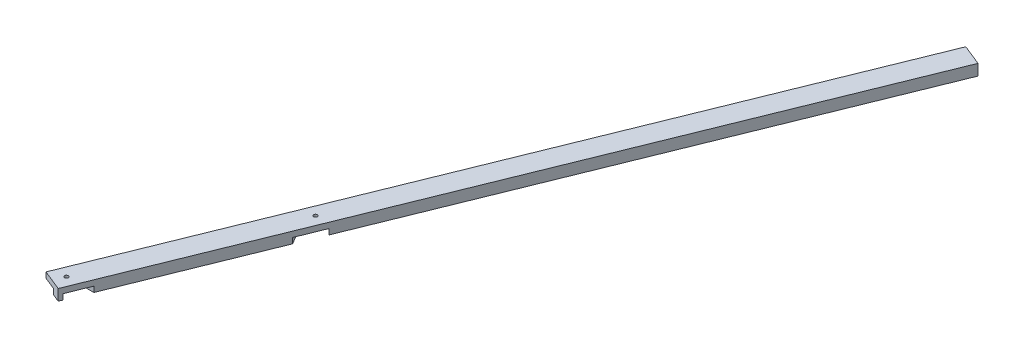
ISO-10303-21;
HEADER;
FILE_DESCRIPTION(('STEP AP214'),'2;1');
FILE_NAME('part.step','',(''),(''),'','','');
FILE_SCHEMA(('AUTOMOTIVE_DESIGN { 1 0 10303 214 1 1 1 1 }'));
ENDSEC;
DATA;
#1=APPLICATION_CONTEXT('core data for automotive mechanical design processes');
#2=APPLICATION_PROTOCOL_DEFINITION('international standard','automotive_design',2000,#1);
#3=PRODUCT_CONTEXT('',#1,'mechanical');
#4=PRODUCT('Part','Part','',(#3));
#5=PRODUCT_RELATED_PRODUCT_CATEGORY('part','',(#4));
#6=PRODUCT_DEFINITION_FORMATION('','',#4);
#7=PRODUCT_DEFINITION_CONTEXT('part definition',#1,'design');
#8=PRODUCT_DEFINITION('design','',#6,#7);
#9=PRODUCT_DEFINITION_SHAPE('','',#8);
#10=(LENGTH_UNIT() NAMED_UNIT(*) SI_UNIT(.MILLI.,.METRE.));
#11=(NAMED_UNIT(*) PLANE_ANGLE_UNIT() SI_UNIT($,.RADIAN.));
#12=(NAMED_UNIT(*) SI_UNIT($,.STERADIAN.) SOLID_ANGLE_UNIT());
#13=UNCERTAINTY_MEASURE_WITH_UNIT(LENGTH_MEASURE(1.E-05),#10,'distance_accuracy_value','');
#14=(GEOMETRIC_REPRESENTATION_CONTEXT(3) GLOBAL_UNCERTAINTY_ASSIGNED_CONTEXT((#13)) GLOBAL_UNIT_ASSIGNED_CONTEXT((#10,
#11,#12)) REPRESENTATION_CONTEXT('',''));
#15=CARTESIAN_POINT('',(0.,0.,0.));
#16=DIRECTION('',(0.,0.,1.));
#17=DIRECTION('',(1.,0.,0.));
#18=AXIS2_PLACEMENT_3D('',#15,#16,#17);
#19=CARTESIAN_POINT('',(0.,0.,0.));
#20=DIRECTION('',(0.,1.,0.));
#21=DIRECTION('',(0.,0.,1.));
#22=AXIS2_PLACEMENT_3D('',#19,#20,#21);
#23=PLANE('',#22);
#24=DIRECTION('',(-0.375,0.,0.927024810886958));
#25=VECTOR('',#24,1.);
#26=CARTESIAN_POINT('',(-254.02633760983,0.,-102.758713127153));
#27=LINE('',#26,#25);
#28=CARTESIAN_POINT('',(143.866072647397,0.,-1086.37507678598));
#29=VERTEX_POINT('',#28);
#30=CARTESIAN_POINT('',(-178.833212823124,0.,-288.641092554873));
#31=VERTEX_POINT('',#30);
#32=EDGE_CURVE('E210',#29,#31,#27,.T.);
#33=ORIENTED_EDGE('',*,*,#32,.T.);
#34=DIRECTION('',(0.508928571428567,0.,0.860808752966464));
#35=VECTOR('',#34,1.);
#36=CARTESIAN_POINT('',(-193.321682541703,0.,-313.147088584599));
#37=LINE('',#36,#35);
#38=CARTESIAN_POINT('',(-193.321682541703,0.,-313.147088584599));
#39=VERTEX_POINT('',#38);
#40=EDGE_CURVE('E145',#39,#31,#37,.T.);
#41=ORIENTED_EDGE('',*,*,#40,.F.);
#42=DIRECTION('',(0.860808752966462,0.,-0.508928571428569));
#43=VECTOR('',#42,1.);
#44=CARTESIAN_POINT('',(-215.267964048959,0.,-300.171976915291));
#45=LINE('',#44,#43);
#46=CARTESIAN_POINT('',(-215.267964048959,0.,-300.171976915291));
#47=VERTEX_POINT('',#46);
#48=EDGE_CURVE('E236',#47,#39,#45,.T.);
#49=ORIENTED_EDGE('',*,*,#48,.F.);
#50=DIRECTION('',(0.375,0.,-0.927024810886958));
#51=VECTOR('',#50,1.);
#52=CARTESIAN_POINT('',(-289.345982904623,0.,-117.046213127153));
#53=LINE('',#52,#51);
#54=CARTESIAN_POINT('',(108.546427352604,0.,-1100.66257678598));
#55=VERTEX_POINT('',#54);
#56=EDGE_CURVE('E216',#47,#55,#53,.T.);
#57=ORIENTED_EDGE('',*,*,#56,.T.);
#58=DIRECTION('',(0.927024810886958,0.,0.374999999999999));
#59=VECTOR('',#58,1.);
#60=CARTESIAN_POINT('',(397.892410257226,0.,-983.61636365883));
#61=LINE('',#60,#59);
#62=EDGE_CURVE('E213',#55,#29,#61,.T.);
#63=ORIENTED_EDGE('',*,*,#62,.T.);
#64=EDGE_LOOP('',(#33,#41,#49,#57,#63));
#65=FACE_BOUND('',#64,.T.);
#66=ADVANCED_FACE('F32',(#65),#23,.F.);
#67=CARTESIAN_POINT('',(-200.025,19.05,-287.053592554873));
#68=DIRECTION('',(0.,-1.,0.));
#69=DIRECTION('',(0.,0.,-1.));
#70=AXIS2_PLACEMENT_3D('',#67,#68,#69);
#71=CYLINDRICAL_SURFACE('',#70,3.175);
#72=CARTESIAN_POINT('',(-200.025,19.05,-287.053592554873));
#73=DIRECTION('',(0.,1.,0.));
#74=DIRECTION('',(0.,0.,1.));
#75=AXIS2_PLACEMENT_3D('',#72,#73,#74);
#76=CIRCLE('',#75,3.175);
#77=CARTESIAN_POINT('',(-200.025,19.05,-290.228592554873));
#78=VERTEX_POINT('',#77);
#79=EDGE_CURVE('E203',#78,#78,#76,.T.);
#80=CARTESIAN_POINT('',(-200.025,9.525,-287.053592554873));
#81=DIRECTION('',(0.,-1.,0.));
#82=DIRECTION('',(0.,0.,-1.));
#83=AXIS2_PLACEMENT_3D('',#80,#81,#82);
#84=CIRCLE('',#83,3.175);
#85=CARTESIAN_POINT('',(-200.025,9.525,-290.228592554873));
#86=VERTEX_POINT('',#85);
#87=EDGE_CURVE('E36',#86,#86,#84,.T.);
#88=CARTESIAN_POINT('',(-200.025,19.05,-290.228592554873));
#89=CARTESIAN_POINT('',(-200.025,18.95078125,-290.228592554873));
#90=CARTESIAN_POINT('',(-200.025,18.8515625,-290.228592554873));
#91=CARTESIAN_POINT('',(-200.025,18.653125,-290.228592554873));
#92=CARTESIAN_POINT('',(-200.025,18.55390625,-290.228592554873));
#93=CARTESIAN_POINT('',(-200.025,18.35546875,-290.228592554873));
#94=CARTESIAN_POINT('',(-200.025,18.25625,-290.228592554873));
#95=CARTESIAN_POINT('',(-200.025,18.0578125,-290.228592554873));
#96=CARTESIAN_POINT('',(-200.025,17.95859375,-290.228592554873));
#97=CARTESIAN_POINT('',(-200.025,17.76015625,-290.228592554873));
#98=CARTESIAN_POINT('',(-200.025,17.6609375,-290.228592554873));
#99=CARTESIAN_POINT('',(-200.025,17.4625,-290.228592554873));
#100=CARTESIAN_POINT('',(-200.025,17.36328125,-290.228592554873));
#101=CARTESIAN_POINT('',(-200.025,17.16484375,-290.228592554873));
#102=CARTESIAN_POINT('',(-200.025,17.065625,-290.228592554873));
#103=CARTESIAN_POINT('',(-200.025,16.8671875,-290.228592554873));
#104=CARTESIAN_POINT('',(-200.025,16.76796875,-290.228592554873));
#105=CARTESIAN_POINT('',(-200.025,16.56953125,-290.228592554873));
#106=CARTESIAN_POINT('',(-200.025,16.4703125,-290.228592554873));
#107=CARTESIAN_POINT('',(-200.025,16.271875,-290.228592554873));
#108=CARTESIAN_POINT('',(-200.025,16.17265625,-290.228592554873));
#109=CARTESIAN_POINT('',(-200.025,15.97421875,-290.228592554873));
#110=CARTESIAN_POINT('',(-200.025,15.875,-290.228592554873));
#111=CARTESIAN_POINT('',(-200.025,15.6765625,-290.228592554873));
#112=CARTESIAN_POINT('',(-200.025,15.57734375,-290.228592554873));
#113=CARTESIAN_POINT('',(-200.025,15.37890625,-290.228592554873));
#114=CARTESIAN_POINT('',(-200.025,15.2796875,-290.228592554873));
#115=CARTESIAN_POINT('',(-200.025,15.08125,-290.228592554873));
#116=CARTESIAN_POINT('',(-200.025,14.98203125,-290.228592554873));
#117=CARTESIAN_POINT('',(-200.025,14.78359375,-290.228592554873));
#118=CARTESIAN_POINT('',(-200.025,14.684375,-290.228592554873));
#119=CARTESIAN_POINT('',(-200.025,14.4859375,-290.228592554873));
#120=CARTESIAN_POINT('',(-200.025,14.38671875,-290.228592554873));
#121=CARTESIAN_POINT('',(-200.025,14.18828125,-290.228592554873));
#122=CARTESIAN_POINT('',(-200.025,14.0890625,-290.228592554873));
#123=CARTESIAN_POINT('',(-200.025,13.890625,-290.228592554873));
#124=CARTESIAN_POINT('',(-200.025,13.79140625,-290.228592554873));
#125=CARTESIAN_POINT('',(-200.025,13.59296875,-290.228592554873));
#126=CARTESIAN_POINT('',(-200.025,13.49375,-290.228592554873));
#127=CARTESIAN_POINT('',(-200.025,13.2953125,-290.228592554873));
#128=CARTESIAN_POINT('',(-200.025,13.19609375,-290.228592554873));
#129=CARTESIAN_POINT('',(-200.025,12.99765625,-290.228592554873));
#130=CARTESIAN_POINT('',(-200.025,12.8984375,-290.228592554873));
#131=CARTESIAN_POINT('',(-200.025,12.7,-290.228592554873));
#132=CARTESIAN_POINT('',(-200.025,12.60078125,-290.228592554873));
#133=CARTESIAN_POINT('',(-200.025,12.40234375,-290.228592554873));
#134=CARTESIAN_POINT('',(-200.025,12.303125,-290.228592554873));
#135=CARTESIAN_POINT('',(-200.025,12.1046875,-290.228592554873));
#136=CARTESIAN_POINT('',(-200.025,12.00546875,-290.228592554873));
#137=CARTESIAN_POINT('',(-200.025,11.80703125,-290.228592554873));
#138=CARTESIAN_POINT('',(-200.025,11.7078125,-290.228592554873));
#139=CARTESIAN_POINT('',(-200.025,11.509375,-290.228592554873));
#140=CARTESIAN_POINT('',(-200.025,11.41015625,-290.228592554873));
#141=CARTESIAN_POINT('',(-200.025,11.21171875,-290.228592554873));
#142=CARTESIAN_POINT('',(-200.025,11.1125,-290.228592554873));
#143=CARTESIAN_POINT('',(-200.025,10.9140625,-290.228592554873));
#144=CARTESIAN_POINT('',(-200.025,10.81484375,-290.228592554873));
#145=CARTESIAN_POINT('',(-200.025,10.61640625,-290.228592554873));
#146=CARTESIAN_POINT('',(-200.025,10.5171875,-290.228592554873));
#147=CARTESIAN_POINT('',(-200.025,10.31875,-290.228592554873));
#148=CARTESIAN_POINT('',(-200.025,10.21953125,-290.228592554873));
#149=CARTESIAN_POINT('',(-200.025,10.02109375,-290.228592554873));
#150=CARTESIAN_POINT('',(-200.025,9.921875,-290.228592554873));
#151=CARTESIAN_POINT('',(-200.025,9.7234375,-290.228592554873));
#152=CARTESIAN_POINT('',(-200.025,9.62421875,-290.228592554873));
#153=CARTESIAN_POINT('',(-200.025,9.525,-290.228592554873));
#154=B_SPLINE_CURVE_WITH_KNOTS('',3,(#88,#89,#90,#91,#92,#93,#94,#95,#96,#97,#98,#99,#100,#101,
#102,#103,#104,#105,#106,#107,#108,#109,#110,#111,#112,#113,#114,#115,#116,#117,#118,#119,#120,
#121,#122,#123,#124,#125,#126,#127,#128,#129,#130,#131,#132,#133,#134,#135,#136,#137,#138,#139,
#140,#141,#142,#143,#144,#145,#146,#147,#148,#149,#150,#151,#152,#153),.UNSPECIFIED.,.F.,.F.,(4,
2,2,2,2,2,2,2,2,2,2,2,2,2,2,2,2,2,2,2,2,2,2,2,2,2,2,2,2,2,2,2,4),(0.,0.29765625,0.5953125,
0.892968750000001,1.190625,1.48828125,1.7859375,2.08359375,2.38125,2.67890625,2.9765625,
3.27421875,3.571875,3.86953125,4.1671875,4.46484375,4.7625,5.06015625,5.3578125,5.65546875,
5.953125,6.25078125,6.5484375,6.84609375,7.14375,7.44140625,7.7390625,8.03671875,8.334375,
8.63203125,8.9296875,9.22734375,9.525),.UNSPECIFIED.);
#155=EDGE_CURVE('BSEAM289',#78,#86,#154,.T.);
#156=ORIENTED_EDGE('',*,*,#79,.T.);
#157=ORIENTED_EDGE('',*,*,#87,.T.);
#158=ORIENTED_EDGE('',*,*,#155,.T.);
#159=ORIENTED_EDGE('',*,*,#155,.F.);
#160=EDGE_LOOP('',(#156,#158,#157,#159));
#161=FACE_BOUND('',#160,.T.);
#162=ADVANCED_FACE('F289',(#161),#71,.F.);
#163=CARTESIAN_POINT('',(-254.02633760983,19.05,-102.758713127153));
#164=DIRECTION('',(0.927024810886958,0.,0.375));
#165=DIRECTION('',(0.375,0.,-0.927024810886958));
#166=AXIS2_PLACEMENT_3D('',#163,#164,#165);
#167=PLANE('',#166);
#168=DIRECTION('',(0.,-1.,0.));
#169=VECTOR('',#168,1.);
#170=CARTESIAN_POINT('',(-178.833212823124,9.525,-288.641092554873));
#171=LINE('',#170,#169);
#172=CARTESIAN_POINT('',(-178.833212823124,9.525,-288.641092554873));
#173=VERTEX_POINT('',#172);
#174=EDGE_CURVE('E230',#173,#31,#171,.T.);
#175=ORIENTED_EDGE('',*,*,#174,.T.);
#176=ORIENTED_EDGE('',*,*,#32,.F.);
#177=DIRECTION('',(0.,-1.,0.));
#178=VECTOR('',#177,1.);
#179=CARTESIAN_POINT('',(143.866072647397,19.05,-1086.37507678598));
#180=LINE('',#179,#178);
#181=CARTESIAN_POINT('',(143.866072647397,19.05,-1086.37507678598));
#182=VERTEX_POINT('',#181);
#183=EDGE_CURVE('E41',#182,#29,#180,.T.);
#184=ORIENTED_EDGE('',*,*,#183,.F.);
#185=DIRECTION('',(-0.375,0.,0.927024810886958));
#186=VECTOR('',#185,1.);
#187=CARTESIAN_POINT('',(-254.02633760983,19.05,-102.758713127153));
#188=LINE('',#187,#186);
#189=CARTESIAN_POINT('',(-313.333927352603,19.05,43.8535726473965));
#190=VERTEX_POINT('',#189);
#191=EDGE_CURVE('E190',#182,#190,#188,.T.);
#192=ORIENTED_EDGE('',*,*,#191,.T.);
#193=DIRECTION('',(0.,-1.,0.));
#194=VECTOR('',#193,1.);
#195=CARTESIAN_POINT('',(-313.333927352603,19.05,43.8535726473965));
#196=LINE('',#195,#194);
#197=CARTESIAN_POINT('',(-313.333927352603,0.,43.8535726473965));
#198=VERTEX_POINT('',#197);
#199=EDGE_CURVE('E11',#190,#198,#196,.T.);
#200=ORIENTED_EDGE('',*,*,#199,.T.);
#201=CARTESIAN_POINT('',(-311.006492620075,0.,38.1000000000001));
#202=VERTEX_POINT('',#201);
#203=EDGE_CURVE('E209',#202,#198,#27,.T.);
#204=ORIENTED_EDGE('',*,*,#203,.F.);
#205=DIRECTION('',(0.,-1.,0.));
#206=VECTOR('',#205,1.);
#207=CARTESIAN_POINT('',(-311.006492620075,9.525,38.1000000000001));
#208=LINE('',#207,#206);
#209=CARTESIAN_POINT('',(-311.006492620075,9.525,38.1000000000001));
#210=VERTEX_POINT('',#209);
#211=EDGE_CURVE('E56',#210,#202,#208,.T.);
#212=ORIENTED_EDGE('',*,*,#211,.F.);
#213=DIRECTION('',(-0.375,0.,0.927024810886958));
#214=VECTOR('',#213,1.);
#215=CARTESIAN_POINT('',(-254.02633760983,9.525,-102.758713127153));
#216=LINE('',#215,#214);
#217=CARTESIAN_POINT('',(-295.594283764166,9.525,1.80411241501588E-13));
#218=VERTEX_POINT('',#217);
#219=EDGE_CURVE('E160',#218,#210,#216,.T.);
#220=ORIENTED_EDGE('',*,*,#219,.F.);
#221=DIRECTION('',(0.,-1.,0.));
#222=VECTOR('',#221,1.);
#223=CARTESIAN_POINT('',(-295.594283764166,9.525,1.80411241501588E-13));
#224=LINE('',#223,#222);
#225=CARTESIAN_POINT('',(-295.594283764166,0.,1.80411241501588E-13));
#226=VERTEX_POINT('',#225);
#227=EDGE_CURVE('E175',#218,#226,#224,.T.);
#228=ORIENTED_EDGE('',*,*,#227,.T.);
#229=CARTESIAN_POINT('',(-196.814123155019,0.,-244.191092554874));
#230=VERTEX_POINT('',#229);
#231=EDGE_CURVE('E150',#230,#226,#27,.T.);
#232=ORIENTED_EDGE('',*,*,#231,.F.);
#233=DIRECTION('',(0.,-1.,0.));
#234=VECTOR('',#233,1.);
#235=CARTESIAN_POINT('',(-196.814123155019,9.525,-244.191092554873));
#236=LINE('',#235,#234);
#237=CARTESIAN_POINT('',(-196.814123155019,9.525,-244.191092554873));
#238=VERTEX_POINT('',#237);
#239=EDGE_CURVE('E48',#238,#230,#236,.T.);
#240=ORIENTED_EDGE('',*,*,#239,.F.);
#241=DIRECTION('',(-0.375000000000001,0.,0.927024810886958));
#242=VECTOR('',#241,1.);
#243=CARTESIAN_POINT('',(-178.833212823124,9.525,-288.641092554873));
#244=LINE('',#243,#242);
#245=EDGE_CURVE('E135',#173,#238,#244,.T.);
#246=ORIENTED_EDGE('',*,*,#245,.F.);
#247=EDGE_LOOP('',(#175,#176,#184,#192,#200,#204,#212,#220,#228,#232,#240,#246));
#248=FACE_BOUND('',#247,.T.);
#249=ADVANCED_FACE('F148',(#248),#167,.T.);
#250=CARTESIAN_POINT('',(-323.85,19.05,19.05));
#251=DIRECTION('',(0.,-1.,0.));
#252=DIRECTION('',(0.,0.,-1.));
#253=AXIS2_PLACEMENT_3D('',#250,#251,#252);
#254=CYLINDRICAL_SURFACE('',#253,3.17499999999997);
#255=CARTESIAN_POINT('',(-323.85,19.05,19.05));
#256=DIRECTION('',(0.,1.,0.));
#257=DIRECTION('',(0.,0.,1.));
#258=AXIS2_PLACEMENT_3D('',#255,#256,#257);
#259=CIRCLE('',#258,3.17499999999997);
#260=CARTESIAN_POINT('',(-323.85,19.05,15.875));
#261=VERTEX_POINT('',#260);
#262=EDGE_CURVE('E200',#261,#261,#259,.T.);
#263=CARTESIAN_POINT('',(-323.85,9.525,19.05));
#264=DIRECTION('',(0.,-1.,0.));
#265=DIRECTION('',(0.,0.,-1.));
#266=AXIS2_PLACEMENT_3D('',#263,#264,#265);
#267=CIRCLE('',#266,3.17499999999997);
#268=CARTESIAN_POINT('',(-323.85,9.525,15.875));
#269=VERTEX_POINT('',#268);
#270=EDGE_CURVE('E172',#269,#269,#267,.F.);
#271=CARTESIAN_POINT('',(-323.85,19.05,15.875));
#272=CARTESIAN_POINT('',(-323.85,18.95078125,15.875));
#273=CARTESIAN_POINT('',(-323.85,18.8515625,15.875));
#274=CARTESIAN_POINT('',(-323.85,18.653125,15.875));
#275=CARTESIAN_POINT('',(-323.85,18.55390625,15.875));
#276=CARTESIAN_POINT('',(-323.85,18.35546875,15.875));
#277=CARTESIAN_POINT('',(-323.85,18.25625,15.875));
#278=CARTESIAN_POINT('',(-323.85,18.0578125,15.875));
#279=CARTESIAN_POINT('',(-323.85,17.95859375,15.875));
#280=CARTESIAN_POINT('',(-323.85,17.76015625,15.875));
#281=CARTESIAN_POINT('',(-323.85,17.6609375,15.875));
#282=CARTESIAN_POINT('',(-323.85,17.4625,15.875));
#283=CARTESIAN_POINT('',(-323.85,17.36328125,15.875));
#284=CARTESIAN_POINT('',(-323.85,17.16484375,15.875));
#285=CARTESIAN_POINT('',(-323.85,17.065625,15.875));
#286=CARTESIAN_POINT('',(-323.85,16.8671875,15.875));
#287=CARTESIAN_POINT('',(-323.85,16.76796875,15.875));
#288=CARTESIAN_POINT('',(-323.85,16.56953125,15.875));
#289=CARTESIAN_POINT('',(-323.85,16.4703125,15.875));
#290=CARTESIAN_POINT('',(-323.85,16.271875,15.875));
#291=CARTESIAN_POINT('',(-323.85,16.17265625,15.875));
#292=CARTESIAN_POINT('',(-323.85,15.97421875,15.875));
#293=CARTESIAN_POINT('',(-323.85,15.875,15.875));
#294=CARTESIAN_POINT('',(-323.85,15.6765625,15.875));
#295=CARTESIAN_POINT('',(-323.85,15.57734375,15.875));
#296=CARTESIAN_POINT('',(-323.85,15.37890625,15.875));
#297=CARTESIAN_POINT('',(-323.85,15.2796875,15.875));
#298=CARTESIAN_POINT('',(-323.85,15.08125,15.875));
#299=CARTESIAN_POINT('',(-323.85,14.98203125,15.875));
#300=CARTESIAN_POINT('',(-323.85,14.78359375,15.875));
#301=CARTESIAN_POINT('',(-323.85,14.684375,15.875));
#302=CARTESIAN_POINT('',(-323.85,14.4859375,15.875));
#303=CARTESIAN_POINT('',(-323.85,14.38671875,15.875));
#304=CARTESIAN_POINT('',(-323.85,14.18828125,15.875));
#305=CARTESIAN_POINT('',(-323.85,14.0890625,15.875));
#306=CARTESIAN_POINT('',(-323.85,13.890625,15.875));
#307=CARTESIAN_POINT('',(-323.85,13.79140625,15.875));
#308=CARTESIAN_POINT('',(-323.85,13.59296875,15.875));
#309=CARTESIAN_POINT('',(-323.85,13.49375,15.875));
#310=CARTESIAN_POINT('',(-323.85,13.2953125,15.875));
#311=CARTESIAN_POINT('',(-323.85,13.19609375,15.875));
#312=CARTESIAN_POINT('',(-323.85,12.99765625,15.875));
#313=CARTESIAN_POINT('',(-323.85,12.8984375,15.875));
#314=CARTESIAN_POINT('',(-323.85,12.7,15.875));
#315=CARTESIAN_POINT('',(-323.85,12.60078125,15.875));
#316=CARTESIAN_POINT('',(-323.85,12.40234375,15.875));
#317=CARTESIAN_POINT('',(-323.85,12.303125,15.875));
#318=CARTESIAN_POINT('',(-323.85,12.1046875,15.875));
#319=CARTESIAN_POINT('',(-323.85,12.00546875,15.875));
#320=CARTESIAN_POINT('',(-323.85,11.80703125,15.875));
#321=CARTESIAN_POINT('',(-323.85,11.7078125,15.875));
#322=CARTESIAN_POINT('',(-323.85,11.509375,15.875));
#323=CARTESIAN_POINT('',(-323.85,11.41015625,15.875));
#324=CARTESIAN_POINT('',(-323.85,11.21171875,15.875));
#325=CARTESIAN_POINT('',(-323.85,11.1125,15.875));
#326=CARTESIAN_POINT('',(-323.85,10.9140625,15.875));
#327=CARTESIAN_POINT('',(-323.85,10.81484375,15.875));
#328=CARTESIAN_POINT('',(-323.85,10.61640625,15.875));
#329=CARTESIAN_POINT('',(-323.85,10.5171875,15.875));
#330=CARTESIAN_POINT('',(-323.85,10.31875,15.875));
#331=CARTESIAN_POINT('',(-323.85,10.21953125,15.875));
#332=CARTESIAN_POINT('',(-323.85,10.02109375,15.875));
#333=CARTESIAN_POINT('',(-323.85,9.921875,15.875));
#334=CARTESIAN_POINT('',(-323.85,9.7234375,15.875));
#335=CARTESIAN_POINT('',(-323.85,9.62421875,15.875));
#336=CARTESIAN_POINT('',(-323.85,9.525,15.875));
#337=B_SPLINE_CURVE_WITH_KNOTS('',3,(#271,#272,#273,#274,#275,#276,#277,#278,#279,#280,#281,
#282,#283,#284,#285,#286,#287,#288,#289,#290,#291,#292,#293,#294,#295,#296,#297,#298,#299,#300,
#301,#302,#303,#304,#305,#306,#307,#308,#309,#310,#311,#312,#313,#314,#315,#316,#317,#318,#319,
#320,#321,#322,#323,#324,#325,#326,#327,#328,#329,#330,#331,#332,#333,#334,#335,#336),
.UNSPECIFIED.,.F.,.F.,(4,2,2,2,2,2,2,2,2,2,2,2,2,2,2,2,2,2,2,2,2,2,2,2,2,2,2,2,2,2,2,2,4),(0.,
0.29765625,0.5953125,0.892968750000001,1.190625,1.48828125,1.7859375,2.08359375,2.38125,
2.67890625,2.9765625,3.27421875,3.571875,3.86953125,4.1671875,4.46484375,4.7625,5.06015625,
5.3578125,5.65546875,5.953125,6.25078125,6.5484375,6.84609375,7.14375,7.44140625,7.7390625,
8.03671875,8.334375,8.63203125,8.9296875,9.22734375,9.525),.UNSPECIFIED.);
#338=EDGE_CURVE('BSEAM354',#261,#269,#337,.T.);
#339=ORIENTED_EDGE('',*,*,#262,.T.);
#340=ORIENTED_EDGE('',*,*,#270,.F.);
#341=ORIENTED_EDGE('',*,*,#338,.T.);
#342=ORIENTED_EDGE('',*,*,#338,.F.);
#343=EDGE_LOOP('',(#339,#341,#340,#342));
#344=FACE_BOUND('',#343,.T.);
#345=ADVANCED_FACE('F354',(#344),#254,.F.);
#346=CARTESIAN_POINT('',(-289.345982904623,19.05,-117.046213127153));
#347=DIRECTION('',(-0.927024810886958,0.,-0.375));
#348=DIRECTION('',(-0.375,0.,0.927024810886958));
#349=AXIS2_PLACEMENT_3D('',#346,#347,#348);
#350=PLANE('',#349);
#351=DIRECTION('',(0.,-1.,0.));
#352=VECTOR('',#351,1.);
#353=CARTESIAN_POINT('',(-215.267964048959,9.525,-300.171976915291));
#354=LINE('',#353,#352);
#355=CARTESIAN_POINT('',(-215.267964048959,9.525,-300.171976915291));
#356=VERTEX_POINT('',#355);
#357=EDGE_CURVE('E152',#356,#47,#354,.T.);
#358=ORIENTED_EDGE('',*,*,#357,.F.);
#359=DIRECTION('',(0.375,0.,-0.927024810886958));
#360=VECTOR('',#359,1.);
#361=CARTESIAN_POINT('',(-221.216787176876,9.525,-285.466092554874));
#362=LINE('',#361,#360);
#363=CARTESIAN_POINT('',(-221.216787176876,9.525,-285.466092554874));
#364=VERTEX_POINT('',#363);
#365=EDGE_CURVE('E134',#364,#356,#362,.T.);
#366=ORIENTED_EDGE('',*,*,#365,.F.);
#367=DIRECTION('',(0.,-1.,0.));
#368=VECTOR('',#367,1.);
#369=CARTESIAN_POINT('',(-221.216787176876,9.525,-285.466092554874));
#370=LINE('',#369,#368);
#371=CARTESIAN_POINT('',(-221.216787176876,0.,-285.466092554874));
#372=VERTEX_POINT('',#371);
#373=EDGE_CURVE('E130',#364,#372,#370,.T.);
#374=ORIENTED_EDGE('',*,*,#373,.T.);
#375=CARTESIAN_POINT('',(-336.693507379925,0.,0.));
#376=VERTEX_POINT('',#375);
#377=EDGE_CURVE('E191',#376,#372,#53,.T.);
#378=ORIENTED_EDGE('',*,*,#377,.F.);
#379=DIRECTION('',(0.,-1.,0.));
#380=VECTOR('',#379,1.);
#381=CARTESIAN_POINT('',(-336.693507379925,9.525,0.));
#382=LINE('',#381,#380);
#383=CARTESIAN_POINT('',(-336.693507379925,9.525,0.));
#384=VERTEX_POINT('',#383);
#385=EDGE_CURVE('E180',#384,#376,#382,.T.);
#386=ORIENTED_EDGE('',*,*,#385,.F.);
#387=DIRECTION('',(0.375,0.,-0.927024810886958));
#388=VECTOR('',#387,1.);
#389=CARTESIAN_POINT('',(-289.345982904623,9.525,-117.046213127153));
#390=LINE('',#389,#388);
#391=CARTESIAN_POINT('',(-348.653572647397,9.525,29.5660726473965));
#392=VERTEX_POINT('',#391);
#393=EDGE_CURVE('E169',#392,#384,#390,.T.);
#394=ORIENTED_EDGE('',*,*,#393,.F.);
#395=DIRECTION('',(0.,-1.,0.));
#396=VECTOR('',#395,1.);
#397=CARTESIAN_POINT('',(-348.653572647397,19.05,29.5660726473965));
#398=LINE('',#397,#396);
#399=CARTESIAN_POINT('',(-348.653572647397,19.05,29.5660726473965));
#400=VERTEX_POINT('',#399);
#401=EDGE_CURVE('E206',#400,#392,#398,.T.);
#402=ORIENTED_EDGE('',*,*,#401,.F.);
#403=DIRECTION('',(0.375,0.,-0.927024810886958));
#404=VECTOR('',#403,1.);
#405=CARTESIAN_POINT('',(-289.345982904623,19.05,-117.046213127153));
#406=LINE('',#405,#404);
#407=CARTESIAN_POINT('',(108.546427352604,19.05,-1100.66257678598));
#408=VERTEX_POINT('',#407);
#409=EDGE_CURVE('E197',#400,#408,#406,.T.);
#410=ORIENTED_EDGE('',*,*,#409,.T.);
#411=DIRECTION('',(0.,-1.,0.));
#412=VECTOR('',#411,1.);
#413=CARTESIAN_POINT('',(108.546427352604,19.05,-1100.66257678598));
#414=LINE('',#413,#412);
#415=EDGE_CURVE('E221',#408,#55,#414,.T.);
#416=ORIENTED_EDGE('',*,*,#415,.T.);
#417=ORIENTED_EDGE('',*,*,#56,.F.);
#418=EDGE_LOOP('',(#358,#366,#374,#378,#386,#394,#402,#410,#416,#417));
#419=FACE_BOUND('',#418,.T.);
#420=ADVANCED_FACE('F239',(#419),#350,.T.);
#421=ORIENTED_EDGE('',*,*,#377,.T.);
#422=DIRECTION('',(-0.50892857142857,0.,-0.860808752966462));
#423=VECTOR('',#422,1.);
#424=CARTESIAN_POINT('',(-196.814123155019,0.,-244.191092554873));
#425=LINE('',#424,#423);
#426=EDGE_CURVE('E256',#230,#372,#425,.T.);
#427=ORIENTED_EDGE('',*,*,#426,.F.);
#428=ORIENTED_EDGE('',*,*,#231,.T.);
#429=DIRECTION('',(-1.,0.,0.));
#430=VECTOR('',#429,1.);
#431=CARTESIAN_POINT('',(0.,0.,7.59810986235769E-13));
#432=LINE('',#431,#430);
#433=EDGE_CURVE('E176',#226,#376,#432,.T.);
#434=ORIENTED_EDGE('',*,*,#433,.T.);
#435=EDGE_LOOP('',(#421,#427,#428,#434));
#436=FACE_BOUND('',#435,.T.);
#437=ADVANCED_FACE('F254',(#436),#23,.F.);
#438=CARTESIAN_POINT('',(-59.3075897427737,19.05,146.612285774549));
#439=DIRECTION('',(0.375,0.,-0.927024810886958));
#440=DIRECTION('',(-0.927024810886958,0.,-0.375));
#441=AXIS2_PLACEMENT_3D('',#438,#439,#440);
#442=PLANE('',#441);
#443=DIRECTION('',(-0.927024810886958,0.,-0.375));
#444=VECTOR('',#443,1.);
#445=CARTESIAN_POINT('',(-59.3075897427737,9.525,146.61228577455));
#446=LINE('',#445,#444);
#447=CARTESIAN_POINT('',(-327.557139606942,9.525,38.1000000000001));
#448=VERTEX_POINT('',#447);
#449=EDGE_CURVE('E167',#448,#392,#446,.T.);
#450=ORIENTED_EDGE('',*,*,#449,.F.);
#451=DIRECTION('',(0.,-1.,0.));
#452=VECTOR('',#451,1.);
#453=CARTESIAN_POINT('',(-327.557139606942,9.525,38.1000000000001));
#454=LINE('',#453,#452);
#455=CARTESIAN_POINT('',(-327.557139606942,0.,38.1000000000001));
#456=VERTEX_POINT('',#455);
#457=EDGE_CURVE('E183',#448,#456,#454,.T.);
#458=ORIENTED_EDGE('',*,*,#457,.T.);
#459=DIRECTION('',(0.927024810886958,0.,0.375));
#460=VECTOR('',#459,1.);
#461=CARTESIAN_POINT('',(-59.3075897427737,0.,146.612285774549));
#462=LINE('',#461,#460);
#463=EDGE_CURVE('E182',#456,#198,#462,.T.);
#464=ORIENTED_EDGE('',*,*,#463,.T.);
#465=ORIENTED_EDGE('',*,*,#199,.F.);
#466=DIRECTION('',(0.927024810886958,0.,0.375));
#467=VECTOR('',#466,1.);
#468=CARTESIAN_POINT('',(-59.3075897427737,19.05,146.612285774549));
#469=LINE('',#468,#467);
#470=EDGE_CURVE('E188',#400,#190,#469,.T.);
#471=ORIENTED_EDGE('',*,*,#470,.F.);
#472=ORIENTED_EDGE('',*,*,#401,.T.);
#473=EDGE_LOOP('',(#450,#458,#464,#465,#471,#472));
#474=FACE_BOUND('',#473,.T.);
#475=ADVANCED_FACE('F34',(#474),#442,.F.);
#476=CARTESIAN_POINT('',(397.892410257226,19.05,-983.61636365883));
#477=DIRECTION('',(0.374999999999999,0.,-0.927024810886958));
#478=DIRECTION('',(-0.927024810886958,0.,-0.374999999999999));
#479=AXIS2_PLACEMENT_3D('',#476,#477,#478);
#480=PLANE('',#479);
#481=ORIENTED_EDGE('',*,*,#62,.F.);
#482=ORIENTED_EDGE('',*,*,#415,.F.);
#483=DIRECTION('',(0.927024810886958,0.,0.374999999999999));
#484=VECTOR('',#483,1.);
#485=CARTESIAN_POINT('',(397.892410257226,19.05,-983.61636365883));
#486=LINE('',#485,#484);
#487=EDGE_CURVE('E194',#408,#182,#486,.T.);
#488=ORIENTED_EDGE('',*,*,#487,.T.);
#489=ORIENTED_EDGE('',*,*,#183,.T.);
#490=EDGE_LOOP('',(#481,#482,#488,#489));
#491=FACE_BOUND('',#490,.T.);
#492=ADVANCED_FACE('F227',(#491),#480,.T.);
#493=CARTESIAN_POINT('',(0.,19.05,0.));
#494=DIRECTION('',(0.,1.,0.));
#495=DIRECTION('',(0.,0.,1.));
#496=AXIS2_PLACEMENT_3D('',#493,#494,#495);
#497=PLANE('',#496);
#498=ORIENTED_EDGE('',*,*,#470,.T.);
#499=ORIENTED_EDGE('',*,*,#191,.F.);
#500=ORIENTED_EDGE('',*,*,#487,.F.);
#501=ORIENTED_EDGE('',*,*,#409,.F.);
#502=EDGE_LOOP('',(#498,#499,#500,#501));
#503=FACE_BOUND('',#502,.T.);
#504=ORIENTED_EDGE('',*,*,#262,.F.);
#505=EDGE_LOOP('',(#504));
#506=FACE_BOUND('',#505,.T.);
#507=ORIENTED_EDGE('',*,*,#79,.F.);
#508=EDGE_LOOP('',(#507));
#509=FACE_BOUND('',#508,.T.);
#510=ADVANCED_FACE('F242',(#503,#506,#509),#497,.T.);
#511=ORIENTED_EDGE('',*,*,#463,.F.);
#512=DIRECTION('',(-1.,0.,0.));
#513=VECTOR('',#512,1.);
#514=CARTESIAN_POINT('',(0.,0.,38.1));
#515=LINE('',#514,#513);
#516=EDGE_CURVE('E161',#202,#456,#515,.T.);
#517=ORIENTED_EDGE('',*,*,#516,.F.);
#518=ORIENTED_EDGE('',*,*,#203,.T.);
#519=EDGE_LOOP('',(#511,#517,#518));
#520=FACE_BOUND('',#519,.T.);
#521=ADVANCED_FACE('F251',(#520),#23,.F.);
#522=CARTESIAN_POINT('',(0.,9.525,7.59810986235769E-13));
#523=DIRECTION('',(0.,0.,1.));
#524=DIRECTION('',(1.,0.,0.));
#525=AXIS2_PLACEMENT_3D('',#522,#523,#524);
#526=PLANE('',#525);
#527=ORIENTED_EDGE('',*,*,#433,.F.);
#528=ORIENTED_EDGE('',*,*,#227,.F.);
#529=DIRECTION('',(-1.,0.,0.));
#530=VECTOR('',#529,1.);
#531=CARTESIAN_POINT('',(0.,9.525,7.59810986235769E-13));
#532=LINE('',#531,#530);
#533=EDGE_CURVE('E158',#218,#384,#532,.T.);
#534=ORIENTED_EDGE('',*,*,#533,.T.);
#535=ORIENTED_EDGE('',*,*,#385,.T.);
#536=EDGE_LOOP('',(#527,#528,#534,#535));
#537=FACE_BOUND('',#536,.T.);
#538=ADVANCED_FACE('F258',(#537),#526,.T.);
#539=CARTESIAN_POINT('',(0.,9.525,38.1));
#540=DIRECTION('',(0.,0.,1.));
#541=DIRECTION('',(1.,0.,0.));
#542=AXIS2_PLACEMENT_3D('',#539,#540,#541);
#543=PLANE('',#542);
#544=ORIENTED_EDGE('',*,*,#516,.T.);
#545=ORIENTED_EDGE('',*,*,#457,.F.);
#546=DIRECTION('',(-1.,0.,0.));
#547=VECTOR('',#546,1.);
#548=CARTESIAN_POINT('',(0.,9.525,38.1));
#549=LINE('',#548,#547);
#550=EDGE_CURVE('E164',#210,#448,#549,.T.);
#551=ORIENTED_EDGE('',*,*,#550,.F.);
#552=ORIENTED_EDGE('',*,*,#211,.T.);
#553=EDGE_LOOP('',(#544,#545,#551,#552));
#554=FACE_BOUND('',#553,.T.);
#555=ADVANCED_FACE('F285',(#554),#543,.F.);
#556=CARTESIAN_POINT('',(0.,9.525,0.));
#557=DIRECTION('',(0.,-1.,0.));
#558=DIRECTION('',(0.,0.,-1.));
#559=AXIS2_PLACEMENT_3D('',#556,#557,#558);
#560=PLANE('',#559);
#561=ORIENTED_EDGE('',*,*,#533,.F.);
#562=ORIENTED_EDGE('',*,*,#219,.T.);
#563=ORIENTED_EDGE('',*,*,#550,.T.);
#564=ORIENTED_EDGE('',*,*,#449,.T.);
#565=ORIENTED_EDGE('',*,*,#393,.T.);
#566=EDGE_LOOP('',(#561,#562,#563,#564,#565));
#567=FACE_BOUND('',#566,.T.);
#568=ORIENTED_EDGE('',*,*,#270,.T.);
#569=EDGE_LOOP('',(#568));
#570=FACE_BOUND('',#569,.T.);
#571=ADVANCED_FACE('F263',(#567,#570),#560,.T.);
#572=CARTESIAN_POINT('',(-193.321682541703,9.525,-313.147088584599));
#573=DIRECTION('',(0.860808752966464,0.,-0.508928571428567));
#574=DIRECTION('',(-0.508928571428567,0.,-0.860808752966464));
#575=AXIS2_PLACEMENT_3D('',#572,#573,#574);
#576=PLANE('',#575);
#577=ORIENTED_EDGE('',*,*,#40,.T.);
#578=ORIENTED_EDGE('',*,*,#174,.F.);
#579=DIRECTION('',(0.508928571428567,0.,0.860808752966464));
#580=VECTOR('',#579,1.);
#581=CARTESIAN_POINT('',(-193.321682541703,9.525,-313.147088584599));
#582=LINE('',#581,#580);
#583=CARTESIAN_POINT('',(-193.321682541703,9.525,-313.147088584599));
#584=VERTEX_POINT('',#583);
#585=EDGE_CURVE('E142',#584,#173,#582,.T.);
#586=ORIENTED_EDGE('',*,*,#585,.F.);
#587=DIRECTION('',(0.,-1.,0.));
#588=VECTOR('',#587,1.);
#589=CARTESIAN_POINT('',(-193.321682541703,9.525,-313.147088584599));
#590=LINE('',#589,#588);
#591=EDGE_CURVE('E273',#584,#39,#590,.T.);
#592=ORIENTED_EDGE('',*,*,#591,.T.);
#593=EDGE_LOOP('',(#577,#578,#586,#592));
#594=FACE_BOUND('',#593,.T.);
#595=ADVANCED_FACE('F277',(#594),#576,.F.);
#596=CARTESIAN_POINT('',(-215.267964048959,9.525,-300.171976915291));
#597=DIRECTION('',(-0.508928571428569,0.,-0.860808752966462));
#598=DIRECTION('',(-0.860808752966462,0.,0.508928571428569));
#599=AXIS2_PLACEMENT_3D('',#596,#597,#598);
#600=PLANE('',#599);
#601=ORIENTED_EDGE('',*,*,#48,.T.);
#602=ORIENTED_EDGE('',*,*,#591,.F.);
#603=DIRECTION('',(0.860808752966462,0.,-0.508928571428569));
#604=VECTOR('',#603,1.);
#605=CARTESIAN_POINT('',(-215.267964048959,9.525,-300.171976915291));
#606=LINE('',#605,#604);
#607=EDGE_CURVE('E154',#356,#584,#606,.T.);
#608=ORIENTED_EDGE('',*,*,#607,.F.);
#609=ORIENTED_EDGE('',*,*,#357,.T.);
#610=EDGE_LOOP('',(#601,#602,#608,#609));
#611=FACE_BOUND('',#610,.T.);
#612=ADVANCED_FACE('F275',(#611),#600,.F.);
#613=CARTESIAN_POINT('',(-196.814123155019,9.525,-244.191092554873));
#614=DIRECTION('',(-0.860808752966462,0.,0.50892857142857));
#615=DIRECTION('',(0.50892857142857,0.,0.860808752966462));
#616=AXIS2_PLACEMENT_3D('',#613,#614,#615);
#617=PLANE('',#616);
#618=ORIENTED_EDGE('',*,*,#426,.T.);
#619=ORIENTED_EDGE('',*,*,#373,.F.);
#620=DIRECTION('',(-0.50892857142857,0.,-0.860808752966462));
#621=VECTOR('',#620,1.);
#622=CARTESIAN_POINT('',(-196.814123155019,9.525,-244.191092554873));
#623=LINE('',#622,#621);
#624=EDGE_CURVE('E126',#238,#364,#623,.T.);
#625=ORIENTED_EDGE('',*,*,#624,.F.);
#626=ORIENTED_EDGE('',*,*,#239,.T.);
#627=EDGE_LOOP('',(#618,#619,#625,#626));
#628=FACE_BOUND('',#627,.T.);
#629=ADVANCED_FACE('F128',(#628),#617,.F.);
#630=CARTESIAN_POINT('',(0.,9.525,0.));
#631=DIRECTION('',(0.,-1.,0.));
#632=DIRECTION('',(0.,0.,-1.));
#633=AXIS2_PLACEMENT_3D('',#630,#631,#632);
#634=PLANE('',#633);
#635=ORIENTED_EDGE('',*,*,#87,.F.);
#636=EDGE_LOOP('',(#635));
#637=FACE_BOUND('',#636,.T.);
#638=ORIENTED_EDGE('',*,*,#245,.T.);
#639=ORIENTED_EDGE('',*,*,#624,.T.);
#640=ORIENTED_EDGE('',*,*,#365,.T.);
#641=ORIENTED_EDGE('',*,*,#607,.T.);
#642=ORIENTED_EDGE('',*,*,#585,.T.);
#643=EDGE_LOOP('',(#638,#639,#640,#641,#642));
#644=FACE_BOUND('',#643,.T.);
#645=ADVANCED_FACE('F139',(#637,#644),#634,.T.);
#646=CLOSED_SHELL('',(#66,#162,#249,#345,#420,#437,#475,#492,#510,#521,#538,#555,#571,#595,#612,
#629,#645));
#647=MANIFOLD_SOLID_BREP('B2',#646);
#648=ADVANCED_BREP_SHAPE_REPRESENTATION('',(#18,#647),#14);
#649=SHAPE_DEFINITION_REPRESENTATION(#9,#648);
ENDSEC;
END-ISO-10303-21;
